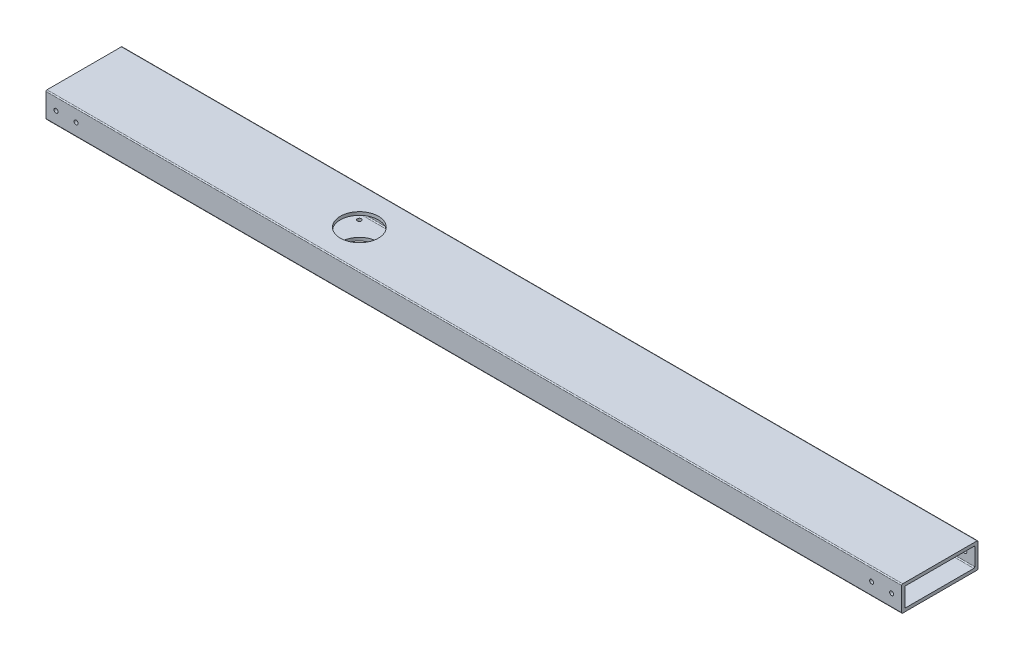
ISO-10303-21;
HEADER;
FILE_DESCRIPTION(('STEP AP214'),'2;1');
FILE_NAME('part.step','',(''),(''),'','','');
FILE_SCHEMA(('AUTOMOTIVE_DESIGN { 1 0 10303 214 1 1 1 1 }'));
ENDSEC;
DATA;
#1=APPLICATION_CONTEXT('core data for automotive mechanical design processes');
#2=APPLICATION_PROTOCOL_DEFINITION('international standard','automotive_design',2000,#1);
#3=PRODUCT_CONTEXT('',#1,'mechanical');
#4=PRODUCT('Part','Part','',(#3));
#5=PRODUCT_RELATED_PRODUCT_CATEGORY('part','',(#4));
#6=PRODUCT_DEFINITION_FORMATION('','',#4);
#7=PRODUCT_DEFINITION_CONTEXT('part definition',#1,'design');
#8=PRODUCT_DEFINITION('design','',#6,#7);
#9=PRODUCT_DEFINITION_SHAPE('','',#8);
#10=(LENGTH_UNIT() NAMED_UNIT(*) SI_UNIT(.MILLI.,.METRE.));
#11=(NAMED_UNIT(*) PLANE_ANGLE_UNIT() SI_UNIT($,.RADIAN.));
#12=(NAMED_UNIT(*) SI_UNIT($,.STERADIAN.) SOLID_ANGLE_UNIT());
#13=UNCERTAINTY_MEASURE_WITH_UNIT(LENGTH_MEASURE(1.E-05),#10,'distance_accuracy_value','');
#14=(GEOMETRIC_REPRESENTATION_CONTEXT(3) GLOBAL_UNCERTAINTY_ASSIGNED_CONTEXT((#13)) GLOBAL_UNIT_ASSIGNED_CONTEXT((#10,
#11,#12)) REPRESENTATION_CONTEXT('',''));
#15=CARTESIAN_POINT('',(0.,0.,0.));
#16=DIRECTION('',(0.,0.,1.));
#17=DIRECTION('',(1.,0.,0.));
#18=AXIS2_PLACEMENT_3D('',#15,#16,#17);
#19=CARTESIAN_POINT('',(427.2,-12.7,-38.1));
#20=DIRECTION('',(0.,1.,0.));
#21=DIRECTION('',(0.,0.,1.));
#22=AXIS2_PLACEMENT_3D('',#19,#20,#21);
#23=PLANE('',#22);
#24=CARTESIAN_POINT('',(-152.4,-12.7,0.));
#25=DIRECTION('',(0.,1.,0.));
#26=DIRECTION('',(0.,0.,1.));
#27=AXIS2_PLACEMENT_3D('',#24,#25,#26);
#28=CIRCLE('',#27,19.);
#29=CARTESIAN_POINT('',(-152.4,-12.7,19.));
#30=VERTEX_POINT('',#29);
#31=EDGE_CURVE('E298',#30,#30,#28,.T.);
#32=ORIENTED_EDGE('',*,*,#31,.T.);
#33=EDGE_LOOP('',(#32));
#34=FACE_BOUND('',#33,.T.);
#35=DIRECTION('',(0.,0.,-1.));
#36=VECTOR('',#35,1.);
#37=CARTESIAN_POINT('',(-427.2,-12.7,-38.1));
#38=LINE('',#37,#36);
#39=CARTESIAN_POINT('',(-427.2,-12.7,37.1));
#40=VERTEX_POINT('',#39);
#41=CARTESIAN_POINT('',(-427.2,-12.7,-37.1));
#42=VERTEX_POINT('',#41);
#43=EDGE_CURVE('E196',#40,#42,#38,.T.);
#44=ORIENTED_EDGE('',*,*,#43,.T.);
#45=DIRECTION('',(-1.,0.,0.));
#46=VECTOR('',#45,1.);
#47=CARTESIAN_POINT('',(427.2,-12.7,-37.1));
#48=LINE('',#47,#46);
#49=CARTESIAN_POINT('',(427.2,-12.7,-37.1));
#50=VERTEX_POINT('',#49);
#51=EDGE_CURVE('E169',#42,#50,#48,.F.);
#52=ORIENTED_EDGE('',*,*,#51,.T.);
#53=DIRECTION('',(0.,0.,-1.));
#54=VECTOR('',#53,1.);
#55=CARTESIAN_POINT('',(427.2,-12.7,-38.1));
#56=LINE('',#55,#54);
#57=CARTESIAN_POINT('',(427.2,-12.7,37.1));
#58=VERTEX_POINT('',#57);
#59=EDGE_CURVE('E380',#58,#50,#56,.T.);
#60=ORIENTED_EDGE('',*,*,#59,.F.);
#61=DIRECTION('',(-1.,0.,0.));
#62=VECTOR('',#61,1.);
#63=CARTESIAN_POINT('',(427.2,-12.7,37.1));
#64=LINE('',#63,#62);
#65=EDGE_CURVE('E175',#58,#40,#64,.T.);
#66=ORIENTED_EDGE('',*,*,#65,.T.);
#67=EDGE_LOOP('',(#44,#52,#60,#66));
#68=FACE_BOUND('',#67,.T.);
#69=CARTESIAN_POINT('',(-123.832886040063,-12.7,28.5671139599365));
#70=DIRECTION('',(0.,-1.,0.));
#71=DIRECTION('',(0.,0.,-1.));
#72=AXIS2_PLACEMENT_3D('',#69,#70,#71);
#73=CIRCLE('',#72,1.99999999999999);
#74=CARTESIAN_POINT('',(-123.832886040063,-12.7,26.5671139599365));
#75=VERTEX_POINT('',#74);
#76=EDGE_CURVE('E411',#75,#75,#73,.T.);
#77=ORIENTED_EDGE('',*,*,#76,.F.);
#78=EDGE_LOOP('',(#77));
#79=FACE_BOUND('',#78,.T.);
#80=CARTESIAN_POINT('',(-123.832886040063,-12.7,-28.5671139599365));
#81=DIRECTION('',(0.,-1.,0.));
#82=DIRECTION('',(0.,0.,-1.));
#83=AXIS2_PLACEMENT_3D('',#80,#81,#82);
#84=CIRCLE('',#83,1.99999999999999);
#85=CARTESIAN_POINT('',(-123.832886040063,-12.7,-30.5671139599365));
#86=VERTEX_POINT('',#85);
#87=EDGE_CURVE('E415',#86,#86,#84,.T.);
#88=ORIENTED_EDGE('',*,*,#87,.F.);
#89=EDGE_LOOP('',(#88));
#90=FACE_BOUND('',#89,.T.);
#91=CARTESIAN_POINT('',(-180.967113959937,-12.7,-28.5671139599365));
#92=DIRECTION('',(0.,-1.,0.));
#93=DIRECTION('',(0.,0.,-1.));
#94=AXIS2_PLACEMENT_3D('',#91,#92,#93);
#95=CIRCLE('',#94,2.);
#96=CARTESIAN_POINT('',(-180.967113959937,-12.7,-30.5671139599365));
#97=VERTEX_POINT('',#96);
#98=EDGE_CURVE('E419',#97,#97,#95,.T.);
#99=ORIENTED_EDGE('',*,*,#98,.F.);
#100=EDGE_LOOP('',(#99));
#101=FACE_BOUND('',#100,.T.);
#102=CARTESIAN_POINT('',(-180.967113959937,-12.7,28.5671139599365));
#103=DIRECTION('',(0.,-1.,0.));
#104=DIRECTION('',(0.,0.,-1.));
#105=AXIS2_PLACEMENT_3D('',#102,#103,#104);
#106=CIRCLE('',#105,2.);
#107=CARTESIAN_POINT('',(-180.967113959937,-12.7,26.5671139599365));
#108=VERTEX_POINT('',#107);
#109=EDGE_CURVE('E422',#108,#108,#106,.T.);
#110=ORIENTED_EDGE('',*,*,#109,.F.);
#111=EDGE_LOOP('',(#110));
#112=FACE_BOUND('',#111,.T.);
#113=ADVANCED_FACE('F47',(#34,#68,#79,#90,#101,#112),#23,.F.);
#114=CARTESIAN_POINT('',(427.2,0.,0.));
#115=DIRECTION('',(1.,0.,0.));
#116=DIRECTION('',(0.,0.,-1.));
#117=AXIS2_PLACEMENT_3D('',#114,#115,#116);
#118=PLANE('',#117);
#119=ORIENTED_EDGE('',*,*,#59,.T.);
#120=CARTESIAN_POINT('',(427.2,-11.7,-37.1));
#121=DIRECTION('',(1.,0.,0.));
#122=DIRECTION('',(0.,0.,-1.));
#123=AXIS2_PLACEMENT_3D('',#120,#121,#122);
#124=CIRCLE('',#123,1.);
#125=CARTESIAN_POINT('',(427.2,-11.7,-38.1));
#126=VERTEX_POINT('',#125);
#127=EDGE_CURVE('E230',#50,#126,#124,.T.);
#128=ORIENTED_EDGE('',*,*,#127,.T.);
#129=DIRECTION('',(0.,1.,0.));
#130=VECTOR('',#129,1.);
#131=CARTESIAN_POINT('',(427.2,-12.7,-38.1));
#132=LINE('',#131,#130);
#133=CARTESIAN_POINT('',(427.2,11.7,-38.1));
#134=VERTEX_POINT('',#133);
#135=EDGE_CURVE('E185',#126,#134,#132,.T.);
#136=ORIENTED_EDGE('',*,*,#135,.T.);
#137=CARTESIAN_POINT('',(427.2,11.7,-37.1));
#138=DIRECTION('',(1.,0.,0.));
#139=DIRECTION('',(0.,0.,-1.));
#140=AXIS2_PLACEMENT_3D('',#137,#138,#139);
#141=CIRCLE('',#140,1.);
#142=CARTESIAN_POINT('',(427.2,12.7,-37.1));
#143=VERTEX_POINT('',#142);
#144=EDGE_CURVE('E224',#134,#143,#141,.T.);
#145=ORIENTED_EDGE('',*,*,#144,.T.);
#146=DIRECTION('',(0.,0.,1.));
#147=VECTOR('',#146,1.);
#148=CARTESIAN_POINT('',(427.2,12.7,-38.1));
#149=LINE('',#148,#147);
#150=CARTESIAN_POINT('',(427.2,12.7,37.1));
#151=VERTEX_POINT('',#150);
#152=EDGE_CURVE('E208',#143,#151,#149,.T.);
#153=ORIENTED_EDGE('',*,*,#152,.T.);
#154=CARTESIAN_POINT('',(427.2,11.7,37.1));
#155=DIRECTION('',(1.,0.,0.));
#156=DIRECTION('',(0.,0.,-1.));
#157=AXIS2_PLACEMENT_3D('',#154,#155,#156);
#158=CIRCLE('',#157,1.);
#159=CARTESIAN_POINT('',(427.2,11.7,38.1));
#160=VERTEX_POINT('',#159);
#161=EDGE_CURVE('E221',#151,#160,#158,.T.);
#162=ORIENTED_EDGE('',*,*,#161,.T.);
#163=DIRECTION('',(0.,-1.,0.));
#164=VECTOR('',#163,1.);
#165=CARTESIAN_POINT('',(427.2,-12.7,38.1));
#166=LINE('',#165,#164);
#167=CARTESIAN_POINT('',(427.2,-11.7,38.1));
#168=VERTEX_POINT('',#167);
#169=EDGE_CURVE('E201',#160,#168,#166,.T.);
#170=ORIENTED_EDGE('',*,*,#169,.T.);
#171=CARTESIAN_POINT('',(427.2,-11.7,37.1));
#172=DIRECTION('',(1.,0.,0.));
#173=DIRECTION('',(0.,0.,-1.));
#174=AXIS2_PLACEMENT_3D('',#171,#172,#173);
#175=CIRCLE('',#174,1.);
#176=EDGE_CURVE('E227',#168,#58,#175,.T.);
#177=ORIENTED_EDGE('',*,*,#176,.T.);
#178=EDGE_LOOP('',(#119,#128,#136,#145,#153,#162,#170,#177));
#179=FACE_BOUND('',#178,.T.);
#180=DIRECTION('',(0.,0.,-1.));
#181=VECTOR('',#180,1.);
#182=CARTESIAN_POINT('',(427.2,-9.525,-34.925));
#183=LINE('',#182,#181);
#184=CARTESIAN_POINT('',(427.2,-9.525,33.925));
#185=VERTEX_POINT('',#184);
#186=CARTESIAN_POINT('',(427.2,-9.525,-33.925));
#187=VERTEX_POINT('',#186);
#188=EDGE_CURVE('E351',#185,#187,#183,.T.);
#189=ORIENTED_EDGE('',*,*,#188,.F.);
#190=CARTESIAN_POINT('',(427.2,-8.52500000000001,33.925));
#191=DIRECTION('',(1.,0.,0.));
#192=DIRECTION('',(0.,0.,-1.));
#193=AXIS2_PLACEMENT_3D('',#190,#191,#192);
#194=CIRCLE('',#193,1.);
#195=CARTESIAN_POINT('',(427.2,-8.52500000000001,34.925));
#196=VERTEX_POINT('',#195);
#197=EDGE_CURVE('E282',#185,#196,#194,.F.);
#198=ORIENTED_EDGE('',*,*,#197,.T.);
#199=DIRECTION('',(0.,-1.,0.));
#200=VECTOR('',#199,1.);
#201=CARTESIAN_POINT('',(427.2,-9.525,34.925));
#202=LINE('',#201,#200);
#203=CARTESIAN_POINT('',(427.2,8.52499999999999,34.925));
#204=VERTEX_POINT('',#203);
#205=EDGE_CURVE('E347',#204,#196,#202,.T.);
#206=ORIENTED_EDGE('',*,*,#205,.F.);
#207=CARTESIAN_POINT('',(427.2,8.525,33.925));
#208=DIRECTION('',(1.,0.,0.));
#209=DIRECTION('',(0.,0.,-1.));
#210=AXIS2_PLACEMENT_3D('',#207,#208,#209);
#211=CIRCLE('',#210,1.);
#212=CARTESIAN_POINT('',(427.2,9.525,33.925));
#213=VERTEX_POINT('',#212);
#214=EDGE_CURVE('E288',#204,#213,#211,.F.);
#215=ORIENTED_EDGE('',*,*,#214,.T.);
#216=DIRECTION('',(0.,0.,1.));
#217=VECTOR('',#216,1.);
#218=CARTESIAN_POINT('',(427.2,9.525,-34.925));
#219=LINE('',#218,#217);
#220=CARTESIAN_POINT('',(427.2,9.525,-33.925));
#221=VERTEX_POINT('',#220);
#222=EDGE_CURVE('E359',#221,#213,#219,.T.);
#223=ORIENTED_EDGE('',*,*,#222,.F.);
#224=CARTESIAN_POINT('',(427.2,8.525,-33.925));
#225=DIRECTION('',(1.,0.,0.));
#226=DIRECTION('',(0.,0.,-1.));
#227=AXIS2_PLACEMENT_3D('',#224,#225,#226);
#228=CIRCLE('',#227,1.);
#229=CARTESIAN_POINT('',(427.2,8.52499999999999,-34.925));
#230=VERTEX_POINT('',#229);
#231=EDGE_CURVE('E65',#221,#230,#228,.F.);
#232=ORIENTED_EDGE('',*,*,#231,.T.);
#233=DIRECTION('',(0.,1.,0.));
#234=VECTOR('',#233,1.);
#235=CARTESIAN_POINT('',(427.2,-9.525,-34.925));
#236=LINE('',#235,#234);
#237=CARTESIAN_POINT('',(427.2,-8.52500000000001,-34.925));
#238=VERTEX_POINT('',#237);
#239=EDGE_CURVE('E356',#238,#230,#236,.T.);
#240=ORIENTED_EDGE('',*,*,#239,.F.);
#241=CARTESIAN_POINT('',(427.2,-8.52500000000001,-33.925));
#242=DIRECTION('',(1.,0.,0.));
#243=DIRECTION('',(0.,0.,-1.));
#244=AXIS2_PLACEMENT_3D('',#241,#242,#243);
#245=CIRCLE('',#244,1.);
#246=EDGE_CURVE('E11',#238,#187,#245,.F.);
#247=ORIENTED_EDGE('',*,*,#246,.T.);
#248=EDGE_LOOP('',(#189,#198,#206,#215,#223,#232,#240,#247));
#249=FACE_BOUND('',#248,.T.);
#250=ADVANCED_FACE('F402',(#179,#249),#118,.T.);
#251=CARTESIAN_POINT('',(-427.2,0.,0.));
#252=DIRECTION('',(1.,0.,0.));
#253=DIRECTION('',(0.,0.,-1.));
#254=AXIS2_PLACEMENT_3D('',#251,#252,#253);
#255=PLANE('',#254);
#256=DIRECTION('',(0.,1.,0.));
#257=VECTOR('',#256,1.);
#258=CARTESIAN_POINT('',(-427.2,-12.7,-38.1));
#259=LINE('',#258,#257);
#260=CARTESIAN_POINT('',(-427.2,-11.7,-38.1));
#261=VERTEX_POINT('',#260);
#262=CARTESIAN_POINT('',(-427.2,11.7,-38.1));
#263=VERTEX_POINT('',#262);
#264=EDGE_CURVE('E182',#261,#263,#259,.T.);
#265=ORIENTED_EDGE('',*,*,#264,.F.);
#266=CARTESIAN_POINT('',(-427.2,-11.7,-37.1));
#267=DIRECTION('',(1.,0.,0.));
#268=DIRECTION('',(0.,0.,-1.));
#269=AXIS2_PLACEMENT_3D('',#266,#267,#268);
#270=CIRCLE('',#269,1.);
#271=EDGE_CURVE('E164',#261,#42,#270,.F.);
#272=ORIENTED_EDGE('',*,*,#271,.T.);
#273=ORIENTED_EDGE('',*,*,#43,.F.);
#274=CARTESIAN_POINT('',(-427.2,-11.7,37.1));
#275=DIRECTION('',(1.,0.,0.));
#276=DIRECTION('',(0.,0.,-1.));
#277=AXIS2_PLACEMENT_3D('',#274,#275,#276);
#278=CIRCLE('',#277,1.);
#279=CARTESIAN_POINT('',(-427.2,-11.7,38.1));
#280=VERTEX_POINT('',#279);
#281=EDGE_CURVE('E176',#40,#280,#278,.F.);
#282=ORIENTED_EDGE('',*,*,#281,.T.);
#283=DIRECTION('',(0.,-1.,0.));
#284=VECTOR('',#283,1.);
#285=CARTESIAN_POINT('',(-427.2,-12.7,38.1));
#286=LINE('',#285,#284);
#287=CARTESIAN_POINT('',(-427.2,11.7,38.1));
#288=VERTEX_POINT('',#287);
#289=EDGE_CURVE('E203',#288,#280,#286,.T.);
#290=ORIENTED_EDGE('',*,*,#289,.F.);
#291=CARTESIAN_POINT('',(-427.2,11.7,37.1));
#292=DIRECTION('',(1.,0.,0.));
#293=DIRECTION('',(0.,0.,-1.));
#294=AXIS2_PLACEMENT_3D('',#291,#292,#293);
#295=CIRCLE('',#294,1.);
#296=CARTESIAN_POINT('',(-427.2,12.7,37.1));
#297=VERTEX_POINT('',#296);
#298=EDGE_CURVE('E187',#288,#297,#295,.F.);
#299=ORIENTED_EDGE('',*,*,#298,.T.);
#300=DIRECTION('',(0.,0.,1.));
#301=VECTOR('',#300,1.);
#302=CARTESIAN_POINT('',(-427.2,12.7,-38.1));
#303=LINE('',#302,#301);
#304=CARTESIAN_POINT('',(-427.2,12.7,-37.1));
#305=VERTEX_POINT('',#304);
#306=EDGE_CURVE('E195',#305,#297,#303,.T.);
#307=ORIENTED_EDGE('',*,*,#306,.F.);
#308=CARTESIAN_POINT('',(-427.2,11.7,-37.1));
#309=DIRECTION('',(1.,0.,0.));
#310=DIRECTION('',(0.,0.,-1.));
#311=AXIS2_PLACEMENT_3D('',#308,#309,#310);
#312=CIRCLE('',#311,1.);
#313=EDGE_CURVE('E193',#305,#263,#312,.F.);
#314=ORIENTED_EDGE('',*,*,#313,.T.);
#315=EDGE_LOOP('',(#265,#272,#273,#282,#290,#299,#307,#314));
#316=FACE_BOUND('',#315,.T.);
#317=DIRECTION('',(0.,0.,1.));
#318=VECTOR('',#317,1.);
#319=CARTESIAN_POINT('',(-427.2,9.525,-34.925));
#320=LINE('',#319,#318);
#321=CARTESIAN_POINT('',(-427.2,9.525,-33.925));
#322=VERTEX_POINT('',#321);
#323=CARTESIAN_POINT('',(-427.2,9.525,33.925));
#324=VERTEX_POINT('',#323);
#325=EDGE_CURVE('E352',#322,#324,#320,.T.);
#326=ORIENTED_EDGE('',*,*,#325,.T.);
#327=CARTESIAN_POINT('',(-427.2,8.525,33.925));
#328=DIRECTION('',(1.,0.,0.));
#329=DIRECTION('',(0.,0.,-1.));
#330=AXIS2_PLACEMENT_3D('',#327,#328,#329);
#331=CIRCLE('',#330,1.);
#332=CARTESIAN_POINT('',(-427.2,8.52499999999999,34.925));
#333=VERTEX_POINT('',#332);
#334=EDGE_CURVE('E285',#324,#333,#331,.T.);
#335=ORIENTED_EDGE('',*,*,#334,.T.);
#336=DIRECTION('',(0.,-1.,0.));
#337=VECTOR('',#336,1.);
#338=CARTESIAN_POINT('',(-427.2,-9.525,34.925));
#339=LINE('',#338,#337);
#340=CARTESIAN_POINT('',(-427.2,-8.52500000000001,34.925));
#341=VERTEX_POINT('',#340);
#342=EDGE_CURVE('E346',#333,#341,#339,.T.);
#343=ORIENTED_EDGE('',*,*,#342,.T.);
#344=CARTESIAN_POINT('',(-427.2,-8.52500000000001,33.925));
#345=DIRECTION('',(1.,0.,0.));
#346=DIRECTION('',(0.,0.,-1.));
#347=AXIS2_PLACEMENT_3D('',#344,#345,#346);
#348=CIRCLE('',#347,1.);
#349=CARTESIAN_POINT('',(-427.2,-9.525,33.925));
#350=VERTEX_POINT('',#349);
#351=EDGE_CURVE('E279',#341,#350,#348,.T.);
#352=ORIENTED_EDGE('',*,*,#351,.T.);
#353=DIRECTION('',(0.,0.,-1.));
#354=VECTOR('',#353,1.);
#355=CARTESIAN_POINT('',(-427.2,-9.525,-34.925));
#356=LINE('',#355,#354);
#357=CARTESIAN_POINT('',(-427.2,-9.525,-33.925));
#358=VERTEX_POINT('',#357);
#359=EDGE_CURVE('E366',#350,#358,#356,.T.);
#360=ORIENTED_EDGE('',*,*,#359,.T.);
#361=CARTESIAN_POINT('',(-427.2,-8.52500000000001,-33.925));
#362=DIRECTION('',(1.,0.,0.));
#363=DIRECTION('',(0.,0.,-1.));
#364=AXIS2_PLACEMENT_3D('',#361,#362,#363);
#365=CIRCLE('',#364,1.);
#366=CARTESIAN_POINT('',(-427.2,-8.52500000000001,-34.925));
#367=VERTEX_POINT('',#366);
#368=EDGE_CURVE('E57',#358,#367,#365,.T.);
#369=ORIENTED_EDGE('',*,*,#368,.T.);
#370=DIRECTION('',(0.,1.,0.));
#371=VECTOR('',#370,1.);
#372=CARTESIAN_POINT('',(-427.2,-9.525,-34.925));
#373=LINE('',#372,#371);
#374=CARTESIAN_POINT('',(-427.2,8.52499999999999,-34.925));
#375=VERTEX_POINT('',#374);
#376=EDGE_CURVE('E370',#367,#375,#373,.T.);
#377=ORIENTED_EDGE('',*,*,#376,.T.);
#378=CARTESIAN_POINT('',(-427.2,8.525,-33.925));
#379=DIRECTION('',(1.,0.,0.));
#380=DIRECTION('',(0.,0.,-1.));
#381=AXIS2_PLACEMENT_3D('',#378,#379,#380);
#382=CIRCLE('',#381,1.);
#383=EDGE_CURVE('E274',#375,#322,#382,.T.);
#384=ORIENTED_EDGE('',*,*,#383,.T.);
#385=EDGE_LOOP('',(#326,#335,#343,#352,#360,#369,#377,#384));
#386=FACE_BOUND('',#385,.T.);
#387=ADVANCED_FACE('F190',(#316,#386),#255,.F.);
#388=CARTESIAN_POINT('',(427.2,-12.7,38.1));
#389=DIRECTION('',(0.,0.,-1.));
#390=DIRECTION('',(-1.,0.,0.));
#391=AXIS2_PLACEMENT_3D('',#388,#389,#390);
#392=PLANE('',#391);
#393=CARTESIAN_POINT('',(417.2,0.,38.1));
#394=DIRECTION('',(0.,0.,1.));
#395=DIRECTION('',(1.,0.,0.));
#396=AXIS2_PLACEMENT_3D('',#393,#394,#395);
#397=CIRCLE('',#396,2.);
#398=CARTESIAN_POINT('',(419.2,0.,38.1));
#399=VERTEX_POINT('',#398);
#400=EDGE_CURVE('E449',#399,#399,#397,.T.);
#401=ORIENTED_EDGE('',*,*,#400,.F.);
#402=EDGE_LOOP('',(#401));
#403=FACE_BOUND('',#402,.T.);
#404=CARTESIAN_POINT('',(397.2,0.,38.1));
#405=DIRECTION('',(0.,0.,1.));
#406=DIRECTION('',(1.,0.,0.));
#407=AXIS2_PLACEMENT_3D('',#404,#405,#406);
#408=CIRCLE('',#407,2.);
#409=CARTESIAN_POINT('',(399.2,0.,38.1));
#410=VERTEX_POINT('',#409);
#411=EDGE_CURVE('E461',#410,#410,#408,.T.);
#412=ORIENTED_EDGE('',*,*,#411,.F.);
#413=EDGE_LOOP('',(#412));
#414=FACE_BOUND('',#413,.T.);
#415=CARTESIAN_POINT('',(-417.2,0.,38.1));
#416=DIRECTION('',(0.,0.,1.));
#417=DIRECTION('',(1.,0.,0.));
#418=AXIS2_PLACEMENT_3D('',#415,#416,#417);
#419=CIRCLE('',#418,2.);
#420=CARTESIAN_POINT('',(-415.2,0.,38.1));
#421=VERTEX_POINT('',#420);
#422=EDGE_CURVE('E317',#421,#421,#419,.T.);
#423=ORIENTED_EDGE('',*,*,#422,.F.);
#424=EDGE_LOOP('',(#423));
#425=FACE_BOUND('',#424,.T.);
#426=CARTESIAN_POINT('',(-397.2,0.,38.1));
#427=DIRECTION('',(0.,0.,1.));
#428=DIRECTION('',(1.,0.,0.));
#429=AXIS2_PLACEMENT_3D('',#426,#427,#428);
#430=CIRCLE('',#429,2.);
#431=CARTESIAN_POINT('',(-395.2,0.,38.1));
#432=VERTEX_POINT('',#431);
#433=EDGE_CURVE('E314',#432,#432,#430,.T.);
#434=ORIENTED_EDGE('',*,*,#433,.F.);
#435=EDGE_LOOP('',(#434));
#436=FACE_BOUND('',#435,.T.);
#437=ORIENTED_EDGE('',*,*,#289,.T.);
#438=DIRECTION('',(-1.,0.,0.));
#439=VECTOR('',#438,1.);
#440=CARTESIAN_POINT('',(427.2,-11.7,38.1));
#441=LINE('',#440,#439);
#442=EDGE_CURVE('E264',#280,#168,#441,.F.);
#443=ORIENTED_EDGE('',*,*,#442,.T.);
#444=ORIENTED_EDGE('',*,*,#169,.F.);
#445=DIRECTION('',(-1.,0.,0.));
#446=VECTOR('',#445,1.);
#447=CARTESIAN_POINT('',(427.2,11.7,38.1));
#448=LINE('',#447,#446);
#449=EDGE_CURVE('E260',#160,#288,#448,.T.);
#450=ORIENTED_EDGE('',*,*,#449,.T.);
#451=EDGE_LOOP('',(#437,#443,#444,#450));
#452=FACE_BOUND('',#451,.T.);
#453=ADVANCED_FACE('F393',(#403,#414,#425,#436,#452),#392,.F.);
#454=CARTESIAN_POINT('',(427.2,-12.7,-38.1));
#455=DIRECTION('',(0.,0.,1.));
#456=DIRECTION('',(1.,0.,0.));
#457=AXIS2_PLACEMENT_3D('',#454,#455,#456);
#458=PLANE('',#457);
#459=CARTESIAN_POINT('',(417.2,0.,-38.1));
#460=DIRECTION('',(0.,0.,1.));
#461=DIRECTION('',(1.,0.,0.));
#462=AXIS2_PLACEMENT_3D('',#459,#460,#461);
#463=CIRCLE('',#462,2.);
#464=CARTESIAN_POINT('',(419.2,0.,-38.1));
#465=VERTEX_POINT('',#464);
#466=EDGE_CURVE('E453',#465,#465,#463,.T.);
#467=ORIENTED_EDGE('',*,*,#466,.T.);
#468=EDGE_LOOP('',(#467));
#469=FACE_BOUND('',#468,.T.);
#470=CARTESIAN_POINT('',(397.2,0.,-38.1));
#471=DIRECTION('',(0.,0.,1.));
#472=DIRECTION('',(1.,0.,0.));
#473=AXIS2_PLACEMENT_3D('',#470,#471,#472);
#474=CIRCLE('',#473,2.);
#475=CARTESIAN_POINT('',(399.2,0.,-38.1));
#476=VERTEX_POINT('',#475);
#477=EDGE_CURVE('E465',#476,#476,#474,.T.);
#478=ORIENTED_EDGE('',*,*,#477,.T.);
#479=EDGE_LOOP('',(#478));
#480=FACE_BOUND('',#479,.T.);
#481=CARTESIAN_POINT('',(-417.2,0.,-38.1));
#482=DIRECTION('',(0.,0.,1.));
#483=DIRECTION('',(1.,0.,0.));
#484=AXIS2_PLACEMENT_3D('',#481,#482,#483);
#485=CIRCLE('',#484,2.);
#486=CARTESIAN_POINT('',(-415.2,0.,-38.1));
#487=VERTEX_POINT('',#486);
#488=EDGE_CURVE('E308',#487,#487,#485,.T.);
#489=ORIENTED_EDGE('',*,*,#488,.T.);
#490=EDGE_LOOP('',(#489));
#491=FACE_BOUND('',#490,.T.);
#492=CARTESIAN_POINT('',(-397.2,0.,-38.1));
#493=DIRECTION('',(0.,0.,1.));
#494=DIRECTION('',(1.,0.,0.));
#495=AXIS2_PLACEMENT_3D('',#492,#493,#494);
#496=CIRCLE('',#495,2.);
#497=CARTESIAN_POINT('',(-395.2,0.,-38.1));
#498=VERTEX_POINT('',#497);
#499=EDGE_CURVE('E303',#498,#498,#496,.T.);
#500=ORIENTED_EDGE('',*,*,#499,.T.);
#501=EDGE_LOOP('',(#500));
#502=FACE_BOUND('',#501,.T.);
#503=ORIENTED_EDGE('',*,*,#135,.F.);
#504=DIRECTION('',(-1.,0.,0.));
#505=VECTOR('',#504,1.);
#506=CARTESIAN_POINT('',(427.2,-11.7,-38.1));
#507=LINE('',#506,#505);
#508=EDGE_CURVE('E168',#126,#261,#507,.T.);
#509=ORIENTED_EDGE('',*,*,#508,.T.);
#510=ORIENTED_EDGE('',*,*,#264,.T.);
#511=DIRECTION('',(-1.,0.,0.));
#512=VECTOR('',#511,1.);
#513=CARTESIAN_POINT('',(427.2,11.7,-38.1));
#514=LINE('',#513,#512);
#515=EDGE_CURVE('E188',#263,#134,#514,.F.);
#516=ORIENTED_EDGE('',*,*,#515,.T.);
#517=EDGE_LOOP('',(#503,#509,#510,#516));
#518=FACE_BOUND('',#517,.T.);
#519=ADVANCED_FACE('F181',(#469,#480,#491,#502,#518),#458,.F.);
#520=CARTESIAN_POINT('',(427.2,12.7,-38.1));
#521=DIRECTION('',(0.,-1.,0.));
#522=DIRECTION('',(0.,0.,-1.));
#523=AXIS2_PLACEMENT_3D('',#520,#521,#522);
#524=PLANE('',#523);
#525=CARTESIAN_POINT('',(-152.4,12.7,0.));
#526=DIRECTION('',(0.,1.,0.));
#527=DIRECTION('',(0.,0.,1.));
#528=AXIS2_PLACEMENT_3D('',#525,#526,#527);
#529=CIRCLE('',#528,19.);
#530=CARTESIAN_POINT('',(-152.4,12.7,19.));
#531=VERTEX_POINT('',#530);
#532=EDGE_CURVE('E336',#531,#531,#529,.T.);
#533=ORIENTED_EDGE('',*,*,#532,.F.);
#534=EDGE_LOOP('',(#533));
#535=FACE_BOUND('',#534,.T.);
#536=ORIENTED_EDGE('',*,*,#152,.F.);
#537=DIRECTION('',(-1.,0.,0.));
#538=VECTOR('',#537,1.);
#539=CARTESIAN_POINT('',(427.2,12.7,-37.1));
#540=LINE('',#539,#538);
#541=EDGE_CURVE('E270',#143,#305,#540,.T.);
#542=ORIENTED_EDGE('',*,*,#541,.T.);
#543=ORIENTED_EDGE('',*,*,#306,.T.);
#544=DIRECTION('',(-1.,0.,0.));
#545=VECTOR('',#544,1.);
#546=CARTESIAN_POINT('',(427.2,12.7,37.1));
#547=LINE('',#546,#545);
#548=EDGE_CURVE('E267',#297,#151,#547,.F.);
#549=ORIENTED_EDGE('',*,*,#548,.T.);
#550=EDGE_LOOP('',(#536,#542,#543,#549));
#551=FACE_BOUND('',#550,.T.);
#552=ADVANCED_FACE('F525',(#535,#551),#524,.F.);
#553=CARTESIAN_POINT('',(427.2,-9.525,34.925));
#554=DIRECTION('',(0.,0.,-1.));
#555=DIRECTION('',(-1.,0.,0.));
#556=AXIS2_PLACEMENT_3D('',#553,#554,#555);
#557=PLANE('',#556);
#558=CARTESIAN_POINT('',(417.2,0.,34.925));
#559=DIRECTION('',(0.,0.,-1.));
#560=DIRECTION('',(-1.,0.,0.));
#561=AXIS2_PLACEMENT_3D('',#558,#559,#560);
#562=CIRCLE('',#561,2.);
#563=CARTESIAN_POINT('',(415.2,0.,34.925));
#564=VERTEX_POINT('',#563);
#565=EDGE_CURVE('E51',#564,#564,#562,.T.);
#566=ORIENTED_EDGE('',*,*,#565,.F.);
#567=EDGE_LOOP('',(#566));
#568=FACE_BOUND('',#567,.T.);
#569=CARTESIAN_POINT('',(397.2,0.,34.925));
#570=DIRECTION('',(0.,0.,-1.));
#571=DIRECTION('',(-1.,0.,0.));
#572=AXIS2_PLACEMENT_3D('',#569,#570,#571);
#573=CIRCLE('',#572,2.);
#574=CARTESIAN_POINT('',(395.2,0.,34.925));
#575=VERTEX_POINT('',#574);
#576=EDGE_CURVE('E469',#575,#575,#573,.T.);
#577=ORIENTED_EDGE('',*,*,#576,.F.);
#578=EDGE_LOOP('',(#577));
#579=FACE_BOUND('',#578,.T.);
#580=CARTESIAN_POINT('',(-417.2,0.,34.925));
#581=DIRECTION('',(0.,0.,-1.));
#582=DIRECTION('',(-1.,0.,0.));
#583=AXIS2_PLACEMENT_3D('',#580,#581,#582);
#584=CIRCLE('',#583,2.);
#585=CARTESIAN_POINT('',(-419.2,0.,34.925));
#586=VERTEX_POINT('',#585);
#587=EDGE_CURVE('E304',#586,#586,#584,.T.);
#588=ORIENTED_EDGE('',*,*,#587,.F.);
#589=EDGE_LOOP('',(#588));
#590=FACE_BOUND('',#589,.T.);
#591=CARTESIAN_POINT('',(-397.2,0.,34.925));
#592=DIRECTION('',(0.,0.,-1.));
#593=DIRECTION('',(-1.,0.,0.));
#594=AXIS2_PLACEMENT_3D('',#591,#592,#593);
#595=CIRCLE('',#594,2.);
#596=CARTESIAN_POINT('',(-399.2,0.,34.925));
#597=VERTEX_POINT('',#596);
#598=EDGE_CURVE('E302',#597,#597,#595,.T.);
#599=ORIENTED_EDGE('',*,*,#598,.F.);
#600=EDGE_LOOP('',(#599));
#601=FACE_BOUND('',#600,.T.);
#602=ORIENTED_EDGE('',*,*,#205,.T.);
#603=DIRECTION('',(-1.,0.,0.));
#604=VECTOR('',#603,1.);
#605=CARTESIAN_POINT('',(-427.2,-8.52500000000001,34.925));
#606=LINE('',#605,#604);
#607=EDGE_CURVE('E249',#196,#341,#606,.T.);
#608=ORIENTED_EDGE('',*,*,#607,.T.);
#609=ORIENTED_EDGE('',*,*,#342,.F.);
#610=DIRECTION('',(-1.,0.,0.));
#611=VECTOR('',#610,1.);
#612=CARTESIAN_POINT('',(427.2,8.525,34.925));
#613=LINE('',#612,#611);
#614=EDGE_CURVE('E246',#333,#204,#613,.F.);
#615=ORIENTED_EDGE('',*,*,#614,.T.);
#616=EDGE_LOOP('',(#602,#608,#609,#615));
#617=FACE_BOUND('',#616,.T.);
#618=ADVANCED_FACE('F503',(#568,#579,#590,#601,#617),#557,.T.);
#619=CARTESIAN_POINT('',(427.2,-9.525,-34.925));
#620=DIRECTION('',(0.,1.,0.));
#621=DIRECTION('',(0.,0.,1.));
#622=AXIS2_PLACEMENT_3D('',#619,#620,#621);
#623=PLANE('',#622);
#624=CARTESIAN_POINT('',(-180.967113959937,-9.525,28.5671139599365));
#625=DIRECTION('',(0.,1.,0.));
#626=DIRECTION('',(0.,0.,1.));
#627=AXIS2_PLACEMENT_3D('',#624,#625,#626);
#628=CIRCLE('',#627,2.);
#629=CARTESIAN_POINT('',(-180.967113959937,-9.525,30.5671139599365));
#630=VERTEX_POINT('',#629);
#631=EDGE_CURVE('E425',#630,#630,#628,.T.);
#632=ORIENTED_EDGE('',*,*,#631,.F.);
#633=EDGE_LOOP('',(#632));
#634=FACE_BOUND('',#633,.T.);
#635=CARTESIAN_POINT('',(-180.967113959937,-9.525,-28.5671139599365));
#636=DIRECTION('',(0.,1.,0.));
#637=DIRECTION('',(0.,0.,1.));
#638=AXIS2_PLACEMENT_3D('',#635,#636,#637);
#639=CIRCLE('',#638,2.);
#640=CARTESIAN_POINT('',(-180.967113959937,-9.525,-26.5671139599365));
#641=VERTEX_POINT('',#640);
#642=EDGE_CURVE('E433',#641,#641,#639,.T.);
#643=ORIENTED_EDGE('',*,*,#642,.F.);
#644=EDGE_LOOP('',(#643));
#645=FACE_BOUND('',#644,.T.);
#646=CARTESIAN_POINT('',(-123.832886040063,-9.525,-28.5671139599365));
#647=DIRECTION('',(0.,1.,0.));
#648=DIRECTION('',(0.,0.,1.));
#649=AXIS2_PLACEMENT_3D('',#646,#647,#648);
#650=CIRCLE('',#649,1.99999999999999);
#651=CARTESIAN_POINT('',(-123.832886040063,-9.525,-26.5671139599365));
#652=VERTEX_POINT('',#651);
#653=EDGE_CURVE('E439',#652,#652,#650,.T.);
#654=ORIENTED_EDGE('',*,*,#653,.F.);
#655=EDGE_LOOP('',(#654));
#656=FACE_BOUND('',#655,.T.);
#657=CARTESIAN_POINT('',(-123.832886040063,-9.525,28.5671139599365));
#658=DIRECTION('',(0.,1.,0.));
#659=DIRECTION('',(0.,0.,1.));
#660=AXIS2_PLACEMENT_3D('',#657,#658,#659);
#661=CIRCLE('',#660,1.99999999999999);
#662=CARTESIAN_POINT('',(-123.832886040063,-9.525,30.5671139599365));
#663=VERTEX_POINT('',#662);
#664=EDGE_CURVE('E445',#663,#663,#661,.T.);
#665=ORIENTED_EDGE('',*,*,#664,.F.);
#666=EDGE_LOOP('',(#665));
#667=FACE_BOUND('',#666,.T.);
#668=CARTESIAN_POINT('',(-152.4,-9.525,0.));
#669=DIRECTION('',(0.,1.,0.));
#670=DIRECTION('',(0.,0.,1.));
#671=AXIS2_PLACEMENT_3D('',#668,#669,#670);
#672=CIRCLE('',#671,19.);
#673=CARTESIAN_POINT('',(-152.4,-9.525,19.));
#674=VERTEX_POINT('',#673);
#675=EDGE_CURVE('E297',#674,#674,#672,.T.);
#676=ORIENTED_EDGE('',*,*,#675,.F.);
#677=EDGE_LOOP('',(#676));
#678=FACE_BOUND('',#677,.T.);
#679=ORIENTED_EDGE('',*,*,#359,.F.);
#680=DIRECTION('',(-1.,0.,0.));
#681=VECTOR('',#680,1.);
#682=CARTESIAN_POINT('',(427.2,-9.525,33.925));
#683=LINE('',#682,#681);
#684=EDGE_CURVE('E257',#350,#185,#683,.F.);
#685=ORIENTED_EDGE('',*,*,#684,.T.);
#686=ORIENTED_EDGE('',*,*,#188,.T.);
#687=DIRECTION('',(-1.,0.,0.));
#688=VECTOR('',#687,1.);
#689=CARTESIAN_POINT('',(-427.2,-9.525,-33.925));
#690=LINE('',#689,#688);
#691=EDGE_CURVE('E253',#187,#358,#690,.T.);
#692=ORIENTED_EDGE('',*,*,#691,.T.);
#693=EDGE_LOOP('',(#679,#685,#686,#692));
#694=FACE_BOUND('',#693,.T.);
#695=ADVANCED_FACE('F483',(#634,#645,#656,#667,#678,#694),#623,.T.);
#696=CARTESIAN_POINT('',(427.2,-9.525,-34.925));
#697=DIRECTION('',(0.,0.,1.));
#698=DIRECTION('',(1.,0.,0.));
#699=AXIS2_PLACEMENT_3D('',#696,#697,#698);
#700=PLANE('',#699);
#701=CARTESIAN_POINT('',(417.2,0.,-34.925));
#702=DIRECTION('',(0.,0.,1.));
#703=DIRECTION('',(1.,0.,0.));
#704=AXIS2_PLACEMENT_3D('',#701,#702,#703);
#705=CIRCLE('',#704,2.);
#706=CARTESIAN_POINT('',(419.2,0.,-34.925));
#707=VERTEX_POINT('',#706);
#708=EDGE_CURVE('E457',#707,#707,#705,.T.);
#709=ORIENTED_EDGE('',*,*,#708,.F.);
#710=EDGE_LOOP('',(#709));
#711=FACE_BOUND('',#710,.T.);
#712=CARTESIAN_POINT('',(397.2,0.,-34.925));
#713=DIRECTION('',(0.,0.,1.));
#714=DIRECTION('',(1.,0.,0.));
#715=AXIS2_PLACEMENT_3D('',#712,#713,#714);
#716=CIRCLE('',#715,2.);
#717=CARTESIAN_POINT('',(399.2,0.,-34.925));
#718=VERTEX_POINT('',#717);
#719=EDGE_CURVE('E323',#718,#718,#716,.T.);
#720=ORIENTED_EDGE('',*,*,#719,.F.);
#721=EDGE_LOOP('',(#720));
#722=FACE_BOUND('',#721,.T.);
#723=CARTESIAN_POINT('',(-417.2,0.,-34.925));
#724=DIRECTION('',(0.,0.,1.));
#725=DIRECTION('',(1.,0.,0.));
#726=AXIS2_PLACEMENT_3D('',#723,#724,#725);
#727=CIRCLE('',#726,2.);
#728=CARTESIAN_POINT('',(-415.2,0.,-34.925));
#729=VERTEX_POINT('',#728);
#730=EDGE_CURVE('E307',#729,#729,#727,.T.);
#731=ORIENTED_EDGE('',*,*,#730,.F.);
#732=EDGE_LOOP('',(#731));
#733=FACE_BOUND('',#732,.T.);
#734=CARTESIAN_POINT('',(-397.2,0.,-34.925));
#735=DIRECTION('',(0.,0.,1.));
#736=DIRECTION('',(1.,0.,0.));
#737=AXIS2_PLACEMENT_3D('',#734,#735,#736);
#738=CIRCLE('',#737,2.);
#739=CARTESIAN_POINT('',(-395.2,0.,-34.925));
#740=VERTEX_POINT('',#739);
#741=EDGE_CURVE('E299',#740,#740,#738,.T.);
#742=ORIENTED_EDGE('',*,*,#741,.F.);
#743=EDGE_LOOP('',(#742));
#744=FACE_BOUND('',#743,.T.);
#745=ORIENTED_EDGE('',*,*,#239,.T.);
#746=DIRECTION('',(-1.,0.,0.));
#747=VECTOR('',#746,1.);
#748=CARTESIAN_POINT('',(-427.2,8.525,-34.925));
#749=LINE('',#748,#747);
#750=EDGE_CURVE('E235',#230,#375,#749,.T.);
#751=ORIENTED_EDGE('',*,*,#750,.T.);
#752=ORIENTED_EDGE('',*,*,#376,.F.);
#753=DIRECTION('',(-1.,0.,0.));
#754=VECTOR('',#753,1.);
#755=CARTESIAN_POINT('',(427.2,-8.52500000000001,-34.925));
#756=LINE('',#755,#754);
#757=EDGE_CURVE('E72',#367,#238,#756,.F.);
#758=ORIENTED_EDGE('',*,*,#757,.T.);
#759=EDGE_LOOP('',(#745,#751,#752,#758));
#760=FACE_BOUND('',#759,.T.);
#761=ADVANCED_FACE('F479',(#711,#722,#733,#744,#760),#700,.T.);
#762=CARTESIAN_POINT('',(427.2,9.525,-34.925));
#763=DIRECTION('',(0.,-1.,0.));
#764=DIRECTION('',(0.,0.,-1.));
#765=AXIS2_PLACEMENT_3D('',#762,#763,#764);
#766=PLANE('',#765);
#767=CARTESIAN_POINT('',(-152.4,9.525,0.));
#768=DIRECTION('',(0.,-1.,0.));
#769=DIRECTION('',(0.,0.,-1.));
#770=AXIS2_PLACEMENT_3D('',#767,#768,#769);
#771=CIRCLE('',#770,19.);
#772=CARTESIAN_POINT('',(-152.4,9.525,-19.));
#773=VERTEX_POINT('',#772);
#774=EDGE_CURVE('E293',#773,#773,#771,.T.);
#775=ORIENTED_EDGE('',*,*,#774,.F.);
#776=EDGE_LOOP('',(#775));
#777=FACE_BOUND('',#776,.T.);
#778=ORIENTED_EDGE('',*,*,#325,.F.);
#779=DIRECTION('',(-1.,0.,0.));
#780=VECTOR('',#779,1.);
#781=CARTESIAN_POINT('',(427.2,9.525,-33.925));
#782=LINE('',#781,#780);
#783=EDGE_CURVE('E243',#322,#221,#782,.F.);
#784=ORIENTED_EDGE('',*,*,#783,.T.);
#785=ORIENTED_EDGE('',*,*,#222,.T.);
#786=DIRECTION('',(-1.,0.,0.));
#787=VECTOR('',#786,1.);
#788=CARTESIAN_POINT('',(-427.2,9.525,33.925));
#789=LINE('',#788,#787);
#790=EDGE_CURVE('E239',#213,#324,#789,.T.);
#791=ORIENTED_EDGE('',*,*,#790,.T.);
#792=EDGE_LOOP('',(#778,#784,#785,#791));
#793=FACE_BOUND('',#792,.T.);
#794=ADVANCED_FACE('F482',(#777,#793),#766,.T.);
#795=CARTESIAN_POINT('',(427.2,-11.7,-37.1));
#796=DIRECTION('',(-1.,0.,0.));
#797=DIRECTION('',(0.,0.,1.));
#798=AXIS2_PLACEMENT_3D('',#795,#796,#797);
#799=CYLINDRICAL_SURFACE('',#798,1.);
#800=ORIENTED_EDGE('',*,*,#127,.F.);
#801=ORIENTED_EDGE('',*,*,#51,.F.);
#802=ORIENTED_EDGE('',*,*,#271,.F.);
#803=ORIENTED_EDGE('',*,*,#508,.F.);
#804=EDGE_LOOP('',(#800,#801,#802,#803));
#805=FACE_BOUND('',#804,.T.);
#806=ADVANCED_FACE('F167',(#805),#799,.T.);
#807=CARTESIAN_POINT('',(427.2,8.525,-33.925));
#808=DIRECTION('',(1.,0.,0.));
#809=DIRECTION('',(0.,0.,-1.));
#810=AXIS2_PLACEMENT_3D('',#807,#808,#809);
#811=CYLINDRICAL_SURFACE('',#810,1.);
#812=ORIENTED_EDGE('',*,*,#231,.F.);
#813=ORIENTED_EDGE('',*,*,#783,.F.);
#814=ORIENTED_EDGE('',*,*,#383,.F.);
#815=ORIENTED_EDGE('',*,*,#750,.F.);
#816=EDGE_LOOP('',(#812,#813,#814,#815));
#817=FACE_BOUND('',#816,.T.);
#818=ADVANCED_FACE('F492',(#817),#811,.F.);
#819=CARTESIAN_POINT('',(427.2,-8.52500000000001,33.925));
#820=DIRECTION('',(1.,0.,0.));
#821=DIRECTION('',(0.,0.,-1.));
#822=AXIS2_PLACEMENT_3D('',#819,#820,#821);
#823=CYLINDRICAL_SURFACE('',#822,1.);
#824=ORIENTED_EDGE('',*,*,#197,.F.);
#825=ORIENTED_EDGE('',*,*,#684,.F.);
#826=ORIENTED_EDGE('',*,*,#351,.F.);
#827=ORIENTED_EDGE('',*,*,#607,.F.);
#828=EDGE_LOOP('',(#824,#825,#826,#827));
#829=FACE_BOUND('',#828,.T.);
#830=ADVANCED_FACE('F508',(#829),#823,.F.);
#831=CARTESIAN_POINT('',(427.2,8.525,33.925));
#832=DIRECTION('',(1.,0.,0.));
#833=DIRECTION('',(0.,0.,-1.));
#834=AXIS2_PLACEMENT_3D('',#831,#832,#833);
#835=CYLINDRICAL_SURFACE('',#834,1.);
#836=ORIENTED_EDGE('',*,*,#214,.F.);
#837=ORIENTED_EDGE('',*,*,#614,.F.);
#838=ORIENTED_EDGE('',*,*,#334,.F.);
#839=ORIENTED_EDGE('',*,*,#790,.F.);
#840=EDGE_LOOP('',(#836,#837,#838,#839));
#841=FACE_BOUND('',#840,.T.);
#842=ADVANCED_FACE('F499',(#841),#835,.F.);
#843=CARTESIAN_POINT('',(427.2,-11.7,37.1));
#844=DIRECTION('',(-1.,0.,0.));
#845=DIRECTION('',(0.,0.,1.));
#846=AXIS2_PLACEMENT_3D('',#843,#844,#845);
#847=CYLINDRICAL_SURFACE('',#846,1.);
#848=ORIENTED_EDGE('',*,*,#176,.F.);
#849=ORIENTED_EDGE('',*,*,#442,.F.);
#850=ORIENTED_EDGE('',*,*,#281,.F.);
#851=ORIENTED_EDGE('',*,*,#65,.F.);
#852=EDGE_LOOP('',(#848,#849,#850,#851));
#853=FACE_BOUND('',#852,.T.);
#854=ADVANCED_FACE('F398',(#853),#847,.T.);
#855=CARTESIAN_POINT('',(427.2,-8.52500000000001,-33.925));
#856=DIRECTION('',(1.,0.,0.));
#857=DIRECTION('',(0.,0.,-1.));
#858=AXIS2_PLACEMENT_3D('',#855,#856,#857);
#859=CYLINDRICAL_SURFACE('',#858,1.);
#860=ORIENTED_EDGE('',*,*,#246,.F.);
#861=ORIENTED_EDGE('',*,*,#757,.F.);
#862=ORIENTED_EDGE('',*,*,#368,.F.);
#863=ORIENTED_EDGE('',*,*,#691,.F.);
#864=EDGE_LOOP('',(#860,#861,#862,#863));
#865=FACE_BOUND('',#864,.T.);
#866=ADVANCED_FACE('F515',(#865),#859,.F.);
#867=CARTESIAN_POINT('',(427.2,11.7,-37.1));
#868=DIRECTION('',(-1.,0.,0.));
#869=DIRECTION('',(0.,0.,1.));
#870=AXIS2_PLACEMENT_3D('',#867,#868,#869);
#871=CYLINDRICAL_SURFACE('',#870,1.);
#872=ORIENTED_EDGE('',*,*,#144,.F.);
#873=ORIENTED_EDGE('',*,*,#515,.F.);
#874=ORIENTED_EDGE('',*,*,#313,.F.);
#875=ORIENTED_EDGE('',*,*,#541,.F.);
#876=EDGE_LOOP('',(#872,#873,#874,#875));
#877=FACE_BOUND('',#876,.T.);
#878=ADVANCED_FACE('F546',(#877),#871,.T.);
#879=CARTESIAN_POINT('',(427.2,11.7,37.1));
#880=DIRECTION('',(-1.,0.,0.));
#881=DIRECTION('',(0.,0.,1.));
#882=AXIS2_PLACEMENT_3D('',#879,#880,#881);
#883=CYLINDRICAL_SURFACE('',#882,1.);
#884=ORIENTED_EDGE('',*,*,#161,.F.);
#885=ORIENTED_EDGE('',*,*,#548,.F.);
#886=ORIENTED_EDGE('',*,*,#298,.F.);
#887=ORIENTED_EDGE('',*,*,#449,.F.);
#888=EDGE_LOOP('',(#884,#885,#886,#887));
#889=FACE_BOUND('',#888,.T.);
#890=ADVANCED_FACE('F49',(#889),#883,.T.);
#891=CARTESIAN_POINT('',(-152.4,-12.7,0.));
#892=DIRECTION('',(0.,1.,0.));
#893=DIRECTION('',(0.,0.,1.));
#894=AXIS2_PLACEMENT_3D('',#891,#892,#893);
#895=CYLINDRICAL_SURFACE('',#894,19.);
#896=ORIENTED_EDGE('',*,*,#774,.T.);
#897=EDGE_LOOP('',(#896));
#898=FACE_BOUND('',#897,.T.);
#899=ORIENTED_EDGE('',*,*,#532,.T.);
#900=EDGE_LOOP('',(#899));
#901=FACE_BOUND('',#900,.T.);
#902=ADVANCED_FACE('F552',(#898,#901),#895,.F.);
#903=ORIENTED_EDGE('',*,*,#675,.T.);
#904=EDGE_LOOP('',(#903));
#905=FACE_BOUND('',#904,.T.);
#906=ORIENTED_EDGE('',*,*,#31,.F.);
#907=EDGE_LOOP('',(#906));
#908=FACE_BOUND('',#907,.T.);
#909=ADVANCED_FACE('F563',(#905,#908),#895,.F.);
#910=CARTESIAN_POINT('',(-397.2,0.,38.1));
#911=DIRECTION('',(0.,0.,1.));
#912=DIRECTION('',(1.,0.,0.));
#913=AXIS2_PLACEMENT_3D('',#910,#911,#912);
#914=CYLINDRICAL_SURFACE('',#913,2.);
#915=ORIENTED_EDGE('',*,*,#741,.T.);
#916=EDGE_LOOP('',(#915));
#917=FACE_BOUND('',#916,.T.);
#918=ORIENTED_EDGE('',*,*,#499,.F.);
#919=EDGE_LOOP('',(#918));
#920=FACE_BOUND('',#919,.T.);
#921=ADVANCED_FACE('F570',(#917,#920),#914,.F.);
#922=ORIENTED_EDGE('',*,*,#598,.T.);
#923=EDGE_LOOP('',(#922));
#924=FACE_BOUND('',#923,.T.);
#925=ORIENTED_EDGE('',*,*,#433,.T.);
#926=EDGE_LOOP('',(#925));
#927=FACE_BOUND('',#926,.T.);
#928=ADVANCED_FACE('F621',(#924,#927),#914,.F.);
#929=CARTESIAN_POINT('',(-417.2,0.,38.1));
#930=DIRECTION('',(0.,0.,1.));
#931=DIRECTION('',(1.,0.,0.));
#932=AXIS2_PLACEMENT_3D('',#929,#930,#931);
#933=CYLINDRICAL_SURFACE('',#932,2.);
#934=ORIENTED_EDGE('',*,*,#587,.T.);
#935=EDGE_LOOP('',(#934));
#936=FACE_BOUND('',#935,.T.);
#937=ORIENTED_EDGE('',*,*,#422,.T.);
#938=EDGE_LOOP('',(#937));
#939=FACE_BOUND('',#938,.T.);
#940=ADVANCED_FACE('F618',(#936,#939),#933,.F.);
#941=ORIENTED_EDGE('',*,*,#730,.T.);
#942=EDGE_LOOP('',(#941));
#943=FACE_BOUND('',#942,.T.);
#944=ORIENTED_EDGE('',*,*,#488,.F.);
#945=EDGE_LOOP('',(#944));
#946=FACE_BOUND('',#945,.T.);
#947=ADVANCED_FACE('F620',(#943,#946),#933,.F.);
#948=CARTESIAN_POINT('',(397.2,0.,38.1));
#949=DIRECTION('',(0.,0.,1.));
#950=DIRECTION('',(1.,0.,0.));
#951=AXIS2_PLACEMENT_3D('',#948,#949,#950);
#952=CYLINDRICAL_SURFACE('',#951,2.);
#953=ORIENTED_EDGE('',*,*,#719,.T.);
#954=EDGE_LOOP('',(#953));
#955=FACE_BOUND('',#954,.T.);
#956=ORIENTED_EDGE('',*,*,#477,.F.);
#957=EDGE_LOOP('',(#956));
#958=FACE_BOUND('',#957,.T.);
#959=ADVANCED_FACE('F476',(#955,#958),#952,.F.);
#960=ORIENTED_EDGE('',*,*,#576,.T.);
#961=EDGE_LOOP('',(#960));
#962=FACE_BOUND('',#961,.T.);
#963=ORIENTED_EDGE('',*,*,#411,.T.);
#964=EDGE_LOOP('',(#963));
#965=FACE_BOUND('',#964,.T.);
#966=ADVANCED_FACE('F614',(#962,#965),#952,.F.);
#967=CARTESIAN_POINT('',(417.2,0.,38.1));
#968=DIRECTION('',(0.,0.,1.));
#969=DIRECTION('',(1.,0.,0.));
#970=AXIS2_PLACEMENT_3D('',#967,#968,#969);
#971=CYLINDRICAL_SURFACE('',#970,2.);
#972=ORIENTED_EDGE('',*,*,#565,.T.);
#973=EDGE_LOOP('',(#972));
#974=FACE_BOUND('',#973,.T.);
#975=ORIENTED_EDGE('',*,*,#400,.T.);
#976=EDGE_LOOP('',(#975));
#977=FACE_BOUND('',#976,.T.);
#978=ADVANCED_FACE('F608',(#974,#977),#971,.F.);
#979=ORIENTED_EDGE('',*,*,#708,.T.);
#980=EDGE_LOOP('',(#979));
#981=FACE_BOUND('',#980,.T.);
#982=ORIENTED_EDGE('',*,*,#466,.F.);
#983=EDGE_LOOP('',(#982));
#984=FACE_BOUND('',#983,.T.);
#985=ADVANCED_FACE('F598',(#981,#984),#971,.F.);
#986=CARTESIAN_POINT('',(-123.832886040063,-12.7,28.5671139599365));
#987=DIRECTION('',(0.,-1.,0.));
#988=DIRECTION('',(0.,0.,-1.));
#989=AXIS2_PLACEMENT_3D('',#986,#987,#988);
#990=CYLINDRICAL_SURFACE('',#989,1.99999999999999);
#991=ORIENTED_EDGE('',*,*,#76,.T.);
#992=EDGE_LOOP('',(#991));
#993=FACE_BOUND('',#992,.T.);
#994=ORIENTED_EDGE('',*,*,#664,.T.);
#995=EDGE_LOOP('',(#994));
#996=FACE_BOUND('',#995,.T.);
#997=ADVANCED_FACE('F596',(#993,#996),#990,.F.);
#998=CARTESIAN_POINT('',(-123.832886040063,-12.7,-28.5671139599365));
#999=DIRECTION('',(0.,-1.,0.));
#1000=DIRECTION('',(0.,0.,-1.));
#1001=AXIS2_PLACEMENT_3D('',#998,#999,#1000);
#1002=CYLINDRICAL_SURFACE('',#1001,1.99999999999999);
#1003=ORIENTED_EDGE('',*,*,#87,.T.);
#1004=EDGE_LOOP('',(#1003));
#1005=FACE_BOUND('',#1004,.T.);
#1006=ORIENTED_EDGE('',*,*,#653,.T.);
#1007=EDGE_LOOP('',(#1006));
#1008=FACE_BOUND('',#1007,.T.);
#1009=ADVANCED_FACE('F597',(#1005,#1008),#1002,.F.);
#1010=CARTESIAN_POINT('',(-180.967113959937,-12.7,-28.5671139599365));
#1011=DIRECTION('',(0.,-1.,0.));
#1012=DIRECTION('',(0.,0.,-1.));
#1013=AXIS2_PLACEMENT_3D('',#1010,#1011,#1012);
#1014=CYLINDRICAL_SURFACE('',#1013,2.);
#1015=ORIENTED_EDGE('',*,*,#98,.T.);
#1016=EDGE_LOOP('',(#1015));
#1017=FACE_BOUND('',#1016,.T.);
#1018=ORIENTED_EDGE('',*,*,#642,.T.);
#1019=EDGE_LOOP('',(#1018));
#1020=FACE_BOUND('',#1019,.T.);
#1021=ADVANCED_FACE('F604',(#1017,#1020),#1014,.F.);
#1022=CARTESIAN_POINT('',(-180.967113959937,-12.7,28.5671139599365));
#1023=DIRECTION('',(0.,-1.,0.));
#1024=DIRECTION('',(0.,0.,-1.));
#1025=AXIS2_PLACEMENT_3D('',#1022,#1023,#1024);
#1026=CYLINDRICAL_SURFACE('',#1025,2.);
#1027=ORIENTED_EDGE('',*,*,#109,.T.);
#1028=EDGE_LOOP('',(#1027));
#1029=FACE_BOUND('',#1028,.T.);
#1030=ORIENTED_EDGE('',*,*,#631,.T.);
#1031=EDGE_LOOP('',(#1030));
#1032=FACE_BOUND('',#1031,.T.);
#1033=ADVANCED_FACE('F812',(#1029,#1032),#1026,.F.);
#1034=CLOSED_SHELL('',(#113,#250,#387,#453,#519,#552,#618,#695,#761,#794,#806,#818,#830,#842,
#854,#866,#878,#890,#902,#909,#921,#928,#940,#947,#959,#966,#978,#985,#997,#1009,#1021,#1033));
#1035=MANIFOLD_SOLID_BREP('B2',#1034);
#1036=ADVANCED_BREP_SHAPE_REPRESENTATION('',(#18,#1035),#14);
#1037=SHAPE_DEFINITION_REPRESENTATION(#9,#1036);
ENDSEC;
END-ISO-10303-21;
